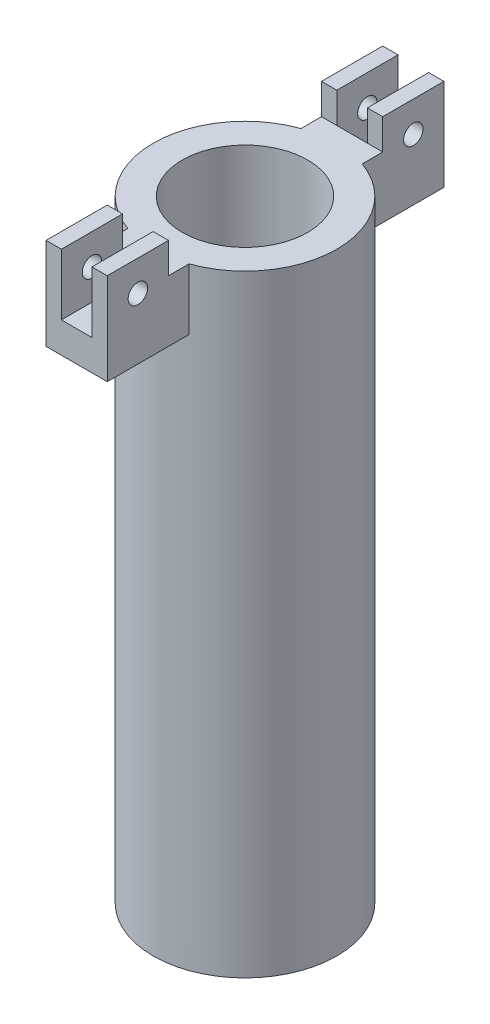
ISO-10303-21;
HEADER;
FILE_DESCRIPTION(('STEP AP214'),'2;1');
FILE_NAME('part.step','',(''),(''),'','','');
FILE_SCHEMA(('AUTOMOTIVE_DESIGN { 1 0 10303 214 1 1 1 1 }'));
ENDSEC;
DATA;
#1=APPLICATION_CONTEXT('core data for automotive mechanical design processes');
#2=APPLICATION_PROTOCOL_DEFINITION('international standard','automotive_design',2000,#1);
#3=PRODUCT_CONTEXT('',#1,'mechanical');
#4=PRODUCT('Part','Part','',(#3));
#5=PRODUCT_RELATED_PRODUCT_CATEGORY('part','',(#4));
#6=PRODUCT_DEFINITION_FORMATION('','',#4);
#7=PRODUCT_DEFINITION_CONTEXT('part definition',#1,'design');
#8=PRODUCT_DEFINITION('design','',#6,#7);
#9=PRODUCT_DEFINITION_SHAPE('','',#8);
#10=(LENGTH_UNIT() NAMED_UNIT(*) SI_UNIT(.MILLI.,.METRE.));
#11=(NAMED_UNIT(*) PLANE_ANGLE_UNIT() SI_UNIT($,.RADIAN.));
#12=(NAMED_UNIT(*) SI_UNIT($,.STERADIAN.) SOLID_ANGLE_UNIT());
#13=UNCERTAINTY_MEASURE_WITH_UNIT(LENGTH_MEASURE(1.E-05),#10,'distance_accuracy_value','');
#14=(GEOMETRIC_REPRESENTATION_CONTEXT(3) GLOBAL_UNCERTAINTY_ASSIGNED_CONTEXT((#13)) GLOBAL_UNIT_ASSIGNED_CONTEXT((#10,
#11,#12)) REPRESENTATION_CONTEXT('',''));
#15=CARTESIAN_POINT('',(0.,0.,0.));
#16=DIRECTION('',(0.,0.,1.));
#17=DIRECTION('',(1.,0.,0.));
#18=AXIS2_PLACEMENT_3D('',#15,#16,#17);
#19=CARTESIAN_POINT('',(10.,100.,35.));
#20=DIRECTION('',(0.,0.,-1.));
#21=DIRECTION('',(0.,1.,0.));
#22=AXIS2_PLACEMENT_3D('',#19,#20,#21);
#23=PLANE('',#22);
#24=DIRECTION('',(-1.,0.,0.));
#25=VECTOR('',#24,1.);
#26=CARTESIAN_POINT('',(10.,110.,35.));
#27=LINE('',#26,#25);
#28=CARTESIAN_POINT('',(-5.,110.,35.));
#29=VERTEX_POINT('',#28);
#30=CARTESIAN_POINT('',(-10.,110.,35.));
#31=VERTEX_POINT('',#30);
#32=EDGE_CURVE('E226',#29,#31,#27,.T.);
#33=ORIENTED_EDGE('',*,*,#32,.F.);
#34=DIRECTION('',(0.,-1.,0.));
#35=VECTOR('',#34,1.);
#36=CARTESIAN_POINT('',(-5.,110.,35.));
#37=LINE('',#36,#35);
#38=CARTESIAN_POINT('',(-5.,100.,35.));
#39=VERTEX_POINT('',#38);
#40=EDGE_CURVE('E472',#29,#39,#37,.T.);
#41=ORIENTED_EDGE('',*,*,#40,.T.);
#42=DIRECTION('',(-1.,0.,0.));
#43=VECTOR('',#42,1.);
#44=CARTESIAN_POINT('',(10.,100.,35.));
#45=LINE('',#44,#43);
#46=CARTESIAN_POINT('',(-10.,100.,35.));
#47=VERTEX_POINT('',#46);
#48=EDGE_CURVE('E237',#39,#47,#45,.T.);
#49=ORIENTED_EDGE('',*,*,#48,.T.);
#50=DIRECTION('',(0.,-1.,0.));
#51=VECTOR('',#50,1.);
#52=CARTESIAN_POINT('',(-10.,100.,35.));
#53=LINE('',#52,#51);
#54=EDGE_CURVE('E442',#31,#47,#53,.T.);
#55=ORIENTED_EDGE('',*,*,#54,.F.);
#56=EDGE_LOOP('',(#33,#41,#49,#55));
#57=FACE_BOUND('',#56,.T.);
#58=ADVANCED_FACE('F45',(#57),#23,.T.);
#59=CARTESIAN_POINT('',(10.,100.,35.));
#60=VERTEX_POINT('',#59);
#61=CARTESIAN_POINT('',(5.,100.,35.));
#62=VERTEX_POINT('',#61);
#63=EDGE_CURVE('E238',#60,#62,#45,.T.);
#64=ORIENTED_EDGE('',*,*,#63,.T.);
#65=DIRECTION('',(0.,1.,0.));
#66=VECTOR('',#65,1.);
#67=CARTESIAN_POINT('',(5.,110.,35.));
#68=LINE('',#67,#66);
#69=CARTESIAN_POINT('',(5.,110.,35.));
#70=VERTEX_POINT('',#69);
#71=EDGE_CURVE('E390',#62,#70,#68,.T.);
#72=ORIENTED_EDGE('',*,*,#71,.T.);
#73=CARTESIAN_POINT('',(10.,110.,35.));
#74=VERTEX_POINT('',#73);
#75=EDGE_CURVE('E216',#74,#70,#27,.T.);
#76=ORIENTED_EDGE('',*,*,#75,.F.);
#77=DIRECTION('',(0.,-1.,0.));
#78=VECTOR('',#77,1.);
#79=CARTESIAN_POINT('',(10.,100.,35.));
#80=LINE('',#79,#78);
#81=EDGE_CURVE('E427',#74,#60,#80,.T.);
#82=ORIENTED_EDGE('',*,*,#81,.T.);
#83=EDGE_LOOP('',(#64,#72,#76,#82));
#84=FACE_BOUND('',#83,.T.);
#85=ADVANCED_FACE('F488',(#84),#23,.T.);
#86=CARTESIAN_POINT('',(10.,110.,35.));
#87=DIRECTION('',(0.,1.,0.));
#88=DIRECTION('',(0.,0.,1.));
#89=AXIS2_PLACEMENT_3D('',#86,#87,#88);
#90=PLANE('',#89);
#91=DIRECTION('',(-1.,0.,0.));
#92=VECTOR('',#91,1.);
#93=CARTESIAN_POINT('',(10.,110.,55.));
#94=LINE('',#93,#92);
#95=CARTESIAN_POINT('',(-5.,110.,55.));
#96=VERTEX_POINT('',#95);
#97=CARTESIAN_POINT('',(-10.,110.,55.));
#98=VERTEX_POINT('',#97);
#99=EDGE_CURVE('E227',#96,#98,#94,.T.);
#100=ORIENTED_EDGE('',*,*,#99,.F.);
#101=DIRECTION('',(0.,0.,1.));
#102=VECTOR('',#101,1.);
#103=CARTESIAN_POINT('',(-5.,110.,-57.3606797749979));
#104=LINE('',#103,#102);
#105=EDGE_CURVE('E218',#29,#96,#104,.T.);
#106=ORIENTED_EDGE('',*,*,#105,.F.);
#107=ORIENTED_EDGE('',*,*,#32,.T.);
#108=DIRECTION('',(0.,0.,-1.));
#109=VECTOR('',#108,1.);
#110=CARTESIAN_POINT('',(-10.,110.,35.));
#111=LINE('',#110,#109);
#112=EDGE_CURVE('E445',#98,#31,#111,.T.);
#113=ORIENTED_EDGE('',*,*,#112,.F.);
#114=EDGE_LOOP('',(#100,#106,#107,#113));
#115=FACE_BOUND('',#114,.T.);
#116=ADVANCED_FACE('F466',(#115),#90,.T.);
#117=ORIENTED_EDGE('',*,*,#75,.T.);
#118=DIRECTION('',(0.,0.,1.));
#119=VECTOR('',#118,1.);
#120=CARTESIAN_POINT('',(5.,110.,-57.3606797749979));
#121=LINE('',#120,#119);
#122=CARTESIAN_POINT('',(5.,110.,55.));
#123=VERTEX_POINT('',#122);
#124=EDGE_CURVE('E202',#70,#123,#121,.T.);
#125=ORIENTED_EDGE('',*,*,#124,.T.);
#126=CARTESIAN_POINT('',(10.,110.,55.));
#127=VERTEX_POINT('',#126);
#128=EDGE_CURVE('E214',#127,#123,#94,.T.);
#129=ORIENTED_EDGE('',*,*,#128,.F.);
#130=DIRECTION('',(0.,0.,-1.));
#131=VECTOR('',#130,1.);
#132=CARTESIAN_POINT('',(10.,110.,35.));
#133=LINE('',#132,#131);
#134=EDGE_CURVE('E432',#127,#74,#133,.T.);
#135=ORIENTED_EDGE('',*,*,#134,.T.);
#136=EDGE_LOOP('',(#117,#125,#129,#135));
#137=FACE_BOUND('',#136,.T.);
#138=ADVANCED_FACE('F212',(#137),#90,.T.);
#139=CARTESIAN_POINT('',(10.,110.,55.));
#140=DIRECTION('',(0.,0.,1.));
#141=DIRECTION('',(0.,-1.,0.));
#142=AXIS2_PLACEMENT_3D('',#139,#140,#141);
#143=PLANE('',#142);
#144=DIRECTION('',(-1.,0.,0.));
#145=VECTOR('',#144,1.);
#146=CARTESIAN_POINT('',(5.,90.0000000000001,55.));
#147=LINE('',#146,#145);
#148=CARTESIAN_POINT('',(5.,90.0000000000001,55.));
#149=VERTEX_POINT('',#148);
#150=CARTESIAN_POINT('',(-5.,90.0000000000001,55.));
#151=VERTEX_POINT('',#150);
#152=EDGE_CURVE('E63',#149,#151,#147,.T.);
#153=ORIENTED_EDGE('',*,*,#152,.T.);
#154=DIRECTION('',(0.,1.,0.));
#155=VECTOR('',#154,1.);
#156=CARTESIAN_POINT('',(-5.,110.,55.));
#157=LINE('',#156,#155);
#158=EDGE_CURVE('E208',#151,#96,#157,.T.);
#159=ORIENTED_EDGE('',*,*,#158,.T.);
#160=ORIENTED_EDGE('',*,*,#99,.T.);
#161=DIRECTION('',(0.,1.,0.));
#162=VECTOR('',#161,1.);
#163=CARTESIAN_POINT('',(-10.,110.,55.));
#164=LINE('',#163,#162);
#165=CARTESIAN_POINT('',(-10.,80.,55.));
#166=VERTEX_POINT('',#165);
#167=EDGE_CURVE('E449',#166,#98,#164,.T.);
#168=ORIENTED_EDGE('',*,*,#167,.F.);
#169=DIRECTION('',(-1.,0.,0.));
#170=VECTOR('',#169,1.);
#171=CARTESIAN_POINT('',(10.,80.,55.));
#172=LINE('',#171,#170);
#173=CARTESIAN_POINT('',(10.,80.,55.));
#174=VERTEX_POINT('',#173);
#175=EDGE_CURVE('E232',#174,#166,#172,.T.);
#176=ORIENTED_EDGE('',*,*,#175,.F.);
#177=DIRECTION('',(0.,1.,0.));
#178=VECTOR('',#177,1.);
#179=CARTESIAN_POINT('',(10.,110.,55.));
#180=LINE('',#179,#178);
#181=EDGE_CURVE('E224',#174,#127,#180,.T.);
#182=ORIENTED_EDGE('',*,*,#181,.T.);
#183=ORIENTED_EDGE('',*,*,#128,.T.);
#184=DIRECTION('',(0.,-1.,0.));
#185=VECTOR('',#184,1.);
#186=CARTESIAN_POINT('',(5.,110.,55.));
#187=LINE('',#186,#185);
#188=EDGE_CURVE('E198',#123,#149,#187,.T.);
#189=ORIENTED_EDGE('',*,*,#188,.T.);
#190=EDGE_LOOP('',(#153,#159,#160,#168,#176,#182,#183,#189));
#191=FACE_BOUND('',#190,.T.);
#192=ADVANCED_FACE('F221',(#191),#143,.T.);
#193=CARTESIAN_POINT('',(10.,100.,45.));
#194=DIRECTION('',(-1.,0.,0.));
#195=DIRECTION('',(0.,0.,1.));
#196=AXIS2_PLACEMENT_3D('',#193,#194,#195);
#197=CYLINDRICAL_SURFACE('',#196,3.175);
#198=CARTESIAN_POINT('',(-10.,100.,45.));
#199=DIRECTION('',(-1.,0.,0.));
#200=DIRECTION('',(0.,0.,1.));
#201=AXIS2_PLACEMENT_3D('',#198,#199,#200);
#202=CIRCLE('',#201,3.175);
#203=CARTESIAN_POINT('',(-10.,100.,48.175));
#204=VERTEX_POINT('',#203);
#205=EDGE_CURVE('E415',#204,#204,#202,.T.);
#206=ORIENTED_EDGE('',*,*,#205,.T.);
#207=EDGE_LOOP('',(#206));
#208=FACE_BOUND('',#207,.T.);
#209=CARTESIAN_POINT('',(-5.,100.,45.));
#210=DIRECTION('',(1.,0.,0.));
#211=DIRECTION('',(0.,1.,0.));
#212=AXIS2_PLACEMENT_3D('',#209,#210,#211);
#213=CIRCLE('',#212,3.175);
#214=CARTESIAN_POINT('',(-5.,103.175,45.));
#215=VERTEX_POINT('',#214);
#216=EDGE_CURVE('E49',#215,#215,#213,.F.);
#217=ORIENTED_EDGE('',*,*,#216,.F.);
#218=EDGE_LOOP('',(#217));
#219=FACE_BOUND('',#218,.T.);
#220=ADVANCED_FACE('F504',(#208,#219),#197,.F.);
#221=CARTESIAN_POINT('',(10.,100.,45.));
#222=DIRECTION('',(-1.,0.,0.));
#223=DIRECTION('',(0.,0.,1.));
#224=AXIS2_PLACEMENT_3D('',#221,#222,#223);
#225=CIRCLE('',#224,3.175);
#226=CARTESIAN_POINT('',(10.,100.,48.175));
#227=VERTEX_POINT('',#226);
#228=EDGE_CURVE('E416',#227,#227,#225,.T.);
#229=ORIENTED_EDGE('',*,*,#228,.F.);
#230=EDGE_LOOP('',(#229));
#231=FACE_BOUND('',#230,.T.);
#232=CARTESIAN_POINT('',(5.,100.,45.));
#233=DIRECTION('',(-1.,0.,0.));
#234=DIRECTION('',(0.,-1.,0.));
#235=AXIS2_PLACEMENT_3D('',#232,#233,#234);
#236=CIRCLE('',#235,3.175);
#237=CARTESIAN_POINT('',(5.,96.825,45.));
#238=VERTEX_POINT('',#237);
#239=EDGE_CURVE('E380',#238,#238,#236,.F.);
#240=ORIENTED_EDGE('',*,*,#239,.F.);
#241=EDGE_LOOP('',(#240));
#242=FACE_BOUND('',#241,.T.);
#243=ADVANCED_FACE('F506',(#231,#242),#197,.F.);
#244=CARTESIAN_POINT('',(0.,100.,0.));
#245=DIRECTION('',(0.,-1.,0.));
#246=DIRECTION('',(0.,0.,-1.));
#247=AXIS2_PLACEMENT_3D('',#244,#245,#246);
#248=CYLINDRICAL_SURFACE('',#247,30.);
#249=CARTESIAN_POINT('',(0.,-100.,0.));
#250=DIRECTION('',(0.,1.,0.));
#251=DIRECTION('',(0.,0.,1.));
#252=AXIS2_PLACEMENT_3D('',#249,#250,#251);
#253=CIRCLE('',#252,30.);
#254=CARTESIAN_POINT('',(0.,-100.,30.));
#255=VERTEX_POINT('',#254);
#256=EDGE_CURVE('E368',#255,#255,#253,.T.);
#257=ORIENTED_EDGE('',*,*,#256,.T.);
#258=EDGE_LOOP('',(#257));
#259=FACE_BOUND('',#258,.T.);
#260=DIRECTION('',(0.,-1.,0.));
#261=VECTOR('',#260,1.);
#262=CARTESIAN_POINT('',(10.,100.,28.2842712474619));
#263=LINE('',#262,#261);
#264=CARTESIAN_POINT('',(10.,80.,28.2842712474619));
#265=VERTEX_POINT('',#264);
#266=CARTESIAN_POINT('',(10.,100.,28.2842712474619));
#267=VERTEX_POINT('',#266);
#268=EDGE_CURVE('E249',#265,#267,#263,.F.);
#269=ORIENTED_EDGE('',*,*,#268,.F.);
#270=CARTESIAN_POINT('',(0.,80.,0.));
#271=DIRECTION('',(0.,-1.,0.));
#272=DIRECTION('',(0.,0.,-1.));
#273=AXIS2_PLACEMENT_3D('',#270,#271,#272);
#274=CIRCLE('',#273,30.);
#275=CARTESIAN_POINT('',(-10.,80.,28.2842712474619));
#276=VERTEX_POINT('',#275);
#277=EDGE_CURVE('E242',#265,#276,#274,.T.);
#278=ORIENTED_EDGE('',*,*,#277,.T.);
#279=DIRECTION('',(0.,-1.,0.));
#280=VECTOR('',#279,1.);
#281=CARTESIAN_POINT('',(-10.,100.,28.2842712474619));
#282=LINE('',#281,#280);
#283=CARTESIAN_POINT('',(-10.,100.,28.2842712474619));
#284=VERTEX_POINT('',#283);
#285=EDGE_CURVE('E246',#276,#284,#282,.F.);
#286=ORIENTED_EDGE('',*,*,#285,.T.);
#287=CARTESIAN_POINT('',(0.,100.,0.));
#288=DIRECTION('',(0.,1.,0.));
#289=DIRECTION('',(0.,0.,1.));
#290=AXIS2_PLACEMENT_3D('',#287,#288,#289);
#291=CIRCLE('',#290,30.);
#292=CARTESIAN_POINT('',(-10.,100.,-28.2842712474619));
#293=VERTEX_POINT('',#292);
#294=EDGE_CURVE('E11',#293,#284,#291,.T.);
#295=ORIENTED_EDGE('',*,*,#294,.F.);
#296=DIRECTION('',(0.,-1.,0.));
#297=VECTOR('',#296,1.);
#298=CARTESIAN_POINT('',(-10.,100.,-28.2842712474619));
#299=LINE('',#298,#297);
#300=CARTESIAN_POINT('',(-10.,80.,-28.2842712474619));
#301=VERTEX_POINT('',#300);
#302=EDGE_CURVE('E356',#293,#301,#299,.T.);
#303=ORIENTED_EDGE('',*,*,#302,.T.);
#304=CARTESIAN_POINT('',(0.,80.,0.));
#305=DIRECTION('',(0.,1.,0.));
#306=DIRECTION('',(0.,0.,1.));
#307=AXIS2_PLACEMENT_3D('',#304,#305,#306);
#308=CIRCLE('',#307,30.);
#309=CARTESIAN_POINT('',(10.,80.,-28.2842712474619));
#310=VERTEX_POINT('',#309);
#311=EDGE_CURVE('E353',#310,#301,#308,.T.);
#312=ORIENTED_EDGE('',*,*,#311,.F.);
#313=DIRECTION('',(0.,-1.,0.));
#314=VECTOR('',#313,1.);
#315=CARTESIAN_POINT('',(10.,100.,-28.2842712474619));
#316=LINE('',#315,#314);
#317=CARTESIAN_POINT('',(10.,100.,-28.2842712474619));
#318=VERTEX_POINT('',#317);
#319=EDGE_CURVE('E360',#318,#310,#316,.T.);
#320=ORIENTED_EDGE('',*,*,#319,.F.);
#321=EDGE_CURVE('E55',#267,#318,#291,.T.);
#322=ORIENTED_EDGE('',*,*,#321,.F.);
#323=EDGE_LOOP('',(#269,#278,#286,#295,#303,#312,#320,#322));
#324=FACE_BOUND('',#323,.T.);
#325=ADVANCED_FACE('F47',(#259,#324),#248,.T.);
#326=CARTESIAN_POINT('',(10.,110.,-35.));
#327=DIRECTION('',(0.,-1.,0.));
#328=DIRECTION('',(0.,0.,-1.));
#329=AXIS2_PLACEMENT_3D('',#326,#327,#328);
#330=PLANE('',#329);
#331=DIRECTION('',(-1.,0.,0.));
#332=VECTOR('',#331,1.);
#333=CARTESIAN_POINT('',(10.,110.,-55.));
#334=LINE('',#333,#332);
#335=CARTESIAN_POINT('',(10.,110.,-55.));
#336=VERTEX_POINT('',#335);
#337=CARTESIAN_POINT('',(5.,110.,-55.));
#338=VERTEX_POINT('',#337);
#339=EDGE_CURVE('E345',#336,#338,#334,.T.);
#340=ORIENTED_EDGE('',*,*,#339,.T.);
#341=DIRECTION('',(0.,0.,-1.));
#342=VECTOR('',#341,1.);
#343=CARTESIAN_POINT('',(5.,110.,-12.6393202250021));
#344=LINE('',#343,#342);
#345=CARTESIAN_POINT('',(5.,110.,-35.));
#346=VERTEX_POINT('',#345);
#347=EDGE_CURVE('E275',#346,#338,#344,.T.);
#348=ORIENTED_EDGE('',*,*,#347,.F.);
#349=DIRECTION('',(-1.,0.,0.));
#350=VECTOR('',#349,1.);
#351=CARTESIAN_POINT('',(10.,110.,-35.));
#352=LINE('',#351,#350);
#353=CARTESIAN_POINT('',(10.,110.,-35.));
#354=VERTEX_POINT('',#353);
#355=EDGE_CURVE('E340',#354,#346,#352,.T.);
#356=ORIENTED_EDGE('',*,*,#355,.F.);
#357=DIRECTION('',(0.,0.,1.));
#358=VECTOR('',#357,1.);
#359=CARTESIAN_POINT('',(10.,110.,-35.));
#360=LINE('',#359,#358);
#361=EDGE_CURVE('E307',#336,#354,#360,.T.);
#362=ORIENTED_EDGE('',*,*,#361,.F.);
#363=EDGE_LOOP('',(#340,#348,#356,#362));
#364=FACE_BOUND('',#363,.T.);
#365=ADVANCED_FACE('F565',(#364),#330,.F.);
#366=CARTESIAN_POINT('',(10.,100.,-35.));
#367=DIRECTION('',(0.,0.,-1.));
#368=DIRECTION('',(0.,1.,0.));
#369=AXIS2_PLACEMENT_3D('',#366,#367,#368);
#370=PLANE('',#369);
#371=ORIENTED_EDGE('',*,*,#355,.T.);
#372=DIRECTION('',(0.,1.,0.));
#373=VECTOR('',#372,1.);
#374=CARTESIAN_POINT('',(5.,110.,-35.));
#375=LINE('',#374,#373);
#376=CARTESIAN_POINT('',(5.,100.,-35.));
#377=VERTEX_POINT('',#376);
#378=EDGE_CURVE('E257',#377,#346,#375,.T.);
#379=ORIENTED_EDGE('',*,*,#378,.F.);
#380=DIRECTION('',(-1.,0.,0.));
#381=VECTOR('',#380,1.);
#382=CARTESIAN_POINT('',(10.,100.,-35.));
#383=LINE('',#382,#381);
#384=CARTESIAN_POINT('',(10.,100.,-35.));
#385=VERTEX_POINT('',#384);
#386=EDGE_CURVE('E334',#385,#377,#383,.T.);
#387=ORIENTED_EDGE('',*,*,#386,.F.);
#388=DIRECTION('',(0.,-1.,0.));
#389=VECTOR('',#388,1.);
#390=CARTESIAN_POINT('',(10.,100.,-35.));
#391=LINE('',#390,#389);
#392=EDGE_CURVE('E310',#354,#385,#391,.T.);
#393=ORIENTED_EDGE('',*,*,#392,.F.);
#394=EDGE_LOOP('',(#371,#379,#387,#393));
#395=FACE_BOUND('',#394,.T.);
#396=ADVANCED_FACE('F560',(#395),#370,.F.);
#397=CARTESIAN_POINT('',(10.,100.,-45.));
#398=DIRECTION('',(-1.,0.,0.));
#399=DIRECTION('',(0.,0.,1.));
#400=AXIS2_PLACEMENT_3D('',#397,#398,#399);
#401=CYLINDRICAL_SURFACE('',#400,3.175);
#402=CARTESIAN_POINT('',(5.,100.,-45.));
#403=DIRECTION('',(1.,0.,0.));
#404=DIRECTION('',(0.,1.,0.));
#405=AXIS2_PLACEMENT_3D('',#402,#403,#404);
#406=CIRCLE('',#405,3.175);
#407=CARTESIAN_POINT('',(5.,103.175,-45.));
#408=VERTEX_POINT('',#407);
#409=EDGE_CURVE('E299',#408,#408,#406,.T.);
#410=ORIENTED_EDGE('',*,*,#409,.F.);
#411=EDGE_LOOP('',(#410));
#412=FACE_BOUND('',#411,.T.);
#413=CARTESIAN_POINT('',(10.,100.,-45.));
#414=DIRECTION('',(1.,0.,0.));
#415=DIRECTION('',(0.,0.,-1.));
#416=AXIS2_PLACEMENT_3D('',#413,#414,#415);
#417=CIRCLE('',#416,3.175);
#418=CARTESIAN_POINT('',(10.,100.,-48.175));
#419=VERTEX_POINT('',#418);
#420=EDGE_CURVE('E290',#419,#419,#417,.T.);
#421=ORIENTED_EDGE('',*,*,#420,.T.);
#422=EDGE_LOOP('',(#421));
#423=FACE_BOUND('',#422,.T.);
#424=ADVANCED_FACE('F545',(#412,#423),#401,.F.);
#425=CARTESIAN_POINT('',(0.,100.,0.));
#426=DIRECTION('',(0.,1.,0.));
#427=DIRECTION('',(0.,0.,1.));
#428=AXIS2_PLACEMENT_3D('',#425,#426,#427);
#429=PLANE('',#428);
#430=CARTESIAN_POINT('',(0.,100.,0.));
#431=DIRECTION('',(0.,1.,0.));
#432=DIRECTION('',(0.,0.,1.));
#433=AXIS2_PLACEMENT_3D('',#430,#431,#432);
#434=CIRCLE('',#433,20.5);
#435=CARTESIAN_POINT('',(0.,100.,20.5));
#436=VERTEX_POINT('',#435);
#437=EDGE_CURVE('E363',#436,#436,#434,.T.);
#438=ORIENTED_EDGE('',*,*,#437,.F.);
#439=EDGE_LOOP('',(#438));
#440=FACE_BOUND('',#439,.T.);
#441=ORIENTED_EDGE('',*,*,#294,.T.);
#442=DIRECTION('',(0.,0.,-1.));
#443=VECTOR('',#442,1.);
#444=CARTESIAN_POINT('',(-10.,100.,20.5));
#445=LINE('',#444,#443);
#446=EDGE_CURVE('E71',#47,#284,#445,.T.);
#447=ORIENTED_EDGE('',*,*,#446,.F.);
#448=ORIENTED_EDGE('',*,*,#48,.F.);
#449=DIRECTION('',(1.,0.,0.));
#450=VECTOR('',#449,1.);
#451=CARTESIAN_POINT('',(0.,100.,35.));
#452=LINE('',#451,#450);
#453=EDGE_CURVE('E388',#39,#62,#452,.T.);
#454=ORIENTED_EDGE('',*,*,#453,.T.);
#455=ORIENTED_EDGE('',*,*,#63,.F.);
#456=DIRECTION('',(0.,0.,-1.));
#457=VECTOR('',#456,1.);
#458=CARTESIAN_POINT('',(10.,100.,20.5));
#459=LINE('',#458,#457);
#460=EDGE_CURVE('E423',#60,#267,#459,.T.);
#461=ORIENTED_EDGE('',*,*,#460,.T.);
#462=ORIENTED_EDGE('',*,*,#321,.T.);
#463=DIRECTION('',(0.,0.,1.));
#464=VECTOR('',#463,1.);
#465=CARTESIAN_POINT('',(10.,100.,-20.5));
#466=LINE('',#465,#464);
#467=EDGE_CURVE('E313',#385,#318,#466,.T.);
#468=ORIENTED_EDGE('',*,*,#467,.F.);
#469=ORIENTED_EDGE('',*,*,#386,.T.);
#470=CARTESIAN_POINT('',(-5.,100.,-35.));
#471=VERTEX_POINT('',#470);
#472=EDGE_CURVE('E339',#377,#471,#383,.T.);
#473=ORIENTED_EDGE('',*,*,#472,.T.);
#474=CARTESIAN_POINT('',(-10.,100.,-35.));
#475=VERTEX_POINT('',#474);
#476=EDGE_CURVE('E317',#471,#475,#383,.T.);
#477=ORIENTED_EDGE('',*,*,#476,.T.);
#478=DIRECTION('',(0.,0.,1.));
#479=VECTOR('',#478,1.);
#480=CARTESIAN_POINT('',(-10.,100.,-20.5));
#481=LINE('',#480,#479);
#482=EDGE_CURVE('E304',#475,#293,#481,.T.);
#483=ORIENTED_EDGE('',*,*,#482,.T.);
#484=EDGE_LOOP('',(#441,#447,#448,#454,#455,#461,#462,#468,#469,#473,#477,#483));
#485=FACE_BOUND('',#484,.T.);
#486=ADVANCED_FACE('F475',(#440,#485),#429,.T.);
#487=CARTESIAN_POINT('',(0.,-100.,0.));
#488=DIRECTION('',(0.,1.,0.));
#489=DIRECTION('',(0.,0.,1.));
#490=AXIS2_PLACEMENT_3D('',#487,#488,#489);
#491=PLANE('',#490);
#492=ORIENTED_EDGE('',*,*,#256,.F.);
#493=EDGE_LOOP('',(#492));
#494=FACE_BOUND('',#493,.T.);
#495=ADVANCED_FACE('F578',(#494),#491,.F.);
#496=CARTESIAN_POINT('',(0.,-50.,0.));
#497=DIRECTION('',(0.,1.,0.));
#498=DIRECTION('',(0.,0.,1.));
#499=AXIS2_PLACEMENT_3D('',#496,#497,#498);
#500=CYLINDRICAL_SURFACE('',#499,20.5);
#501=CARTESIAN_POINT('',(0.,-50.,0.));
#502=DIRECTION('',(0.,1.,0.));
#503=DIRECTION('',(0.,0.,1.));
#504=AXIS2_PLACEMENT_3D('',#501,#502,#503);
#505=CIRCLE('',#504,20.5);
#506=CARTESIAN_POINT('',(0.,-50.,20.5));
#507=VERTEX_POINT('',#506);
#508=EDGE_CURVE('E364',#507,#507,#505,.T.);
#509=ORIENTED_EDGE('',*,*,#508,.F.);
#510=EDGE_LOOP('',(#509));
#511=FACE_BOUND('',#510,.T.);
#512=ORIENTED_EDGE('',*,*,#437,.T.);
#513=EDGE_LOOP('',(#512));
#514=FACE_BOUND('',#513,.T.);
#515=ADVANCED_FACE('F574',(#511,#514),#500,.F.);
#516=CARTESIAN_POINT('',(0.,-50.,0.));
#517=DIRECTION('',(0.,1.,0.));
#518=DIRECTION('',(0.,0.,1.));
#519=AXIS2_PLACEMENT_3D('',#516,#517,#518);
#520=PLANE('',#519);
#521=ORIENTED_EDGE('',*,*,#508,.T.);
#522=EDGE_LOOP('',(#521));
#523=FACE_BOUND('',#522,.T.);
#524=ADVANCED_FACE('F550',(#523),#520,.T.);
#525=CARTESIAN_POINT('',(10.,0.,0.));
#526=DIRECTION('',(-1.,0.,0.));
#527=DIRECTION('',(0.,0.,1.));
#528=AXIS2_PLACEMENT_3D('',#525,#526,#527);
#529=PLANE('',#528);
#530=ORIENTED_EDGE('',*,*,#420,.F.);
#531=EDGE_LOOP('',(#530));
#532=FACE_BOUND('',#531,.T.);
#533=ORIENTED_EDGE('',*,*,#467,.T.);
#534=ORIENTED_EDGE('',*,*,#319,.T.);
#535=DIRECTION('',(0.,0.,-1.));
#536=VECTOR('',#535,1.);
#537=CARTESIAN_POINT('',(10.,80.,-55.));
#538=LINE('',#537,#536);
#539=CARTESIAN_POINT('',(10.,80.,-55.));
#540=VERTEX_POINT('',#539);
#541=EDGE_CURVE('E300',#310,#540,#538,.T.);
#542=ORIENTED_EDGE('',*,*,#541,.T.);
#543=DIRECTION('',(0.,1.,0.));
#544=VECTOR('',#543,1.);
#545=CARTESIAN_POINT('',(10.,110.,-55.));
#546=LINE('',#545,#544);
#547=EDGE_CURVE('E303',#540,#336,#546,.T.);
#548=ORIENTED_EDGE('',*,*,#547,.T.);
#549=ORIENTED_EDGE('',*,*,#361,.T.);
#550=ORIENTED_EDGE('',*,*,#392,.T.);
#551=EDGE_LOOP('',(#533,#534,#542,#548,#549,#550));
#552=FACE_BOUND('',#551,.T.);
#553=ADVANCED_FACE('F546',(#532,#552),#529,.F.);
#554=CARTESIAN_POINT('',(-10.,0.,0.));
#555=DIRECTION('',(-1.,0.,0.));
#556=DIRECTION('',(0.,0.,1.));
#557=AXIS2_PLACEMENT_3D('',#554,#555,#556);
#558=PLANE('',#557);
#559=CARTESIAN_POINT('',(-10.,100.,-45.));
#560=DIRECTION('',(1.,0.,0.));
#561=DIRECTION('',(0.,0.,-1.));
#562=AXIS2_PLACEMENT_3D('',#559,#560,#561);
#563=CIRCLE('',#562,3.175);
#564=CARTESIAN_POINT('',(-10.,100.,-48.175));
#565=VERTEX_POINT('',#564);
#566=EDGE_CURVE('E295',#565,#565,#563,.T.);
#567=ORIENTED_EDGE('',*,*,#566,.T.);
#568=EDGE_LOOP('',(#567));
#569=FACE_BOUND('',#568,.T.);
#570=ORIENTED_EDGE('',*,*,#302,.F.);
#571=ORIENTED_EDGE('',*,*,#482,.F.);
#572=DIRECTION('',(0.,-1.,0.));
#573=VECTOR('',#572,1.);
#574=CARTESIAN_POINT('',(-10.,100.,-35.));
#575=LINE('',#574,#573);
#576=CARTESIAN_POINT('',(-10.,110.,-35.));
#577=VERTEX_POINT('',#576);
#578=EDGE_CURVE('E328',#577,#475,#575,.T.);
#579=ORIENTED_EDGE('',*,*,#578,.F.);
#580=DIRECTION('',(0.,0.,1.));
#581=VECTOR('',#580,1.);
#582=CARTESIAN_POINT('',(-10.,110.,-35.));
#583=LINE('',#582,#581);
#584=CARTESIAN_POINT('',(-10.,110.,-55.));
#585=VERTEX_POINT('',#584);
#586=EDGE_CURVE('E324',#585,#577,#583,.T.);
#587=ORIENTED_EDGE('',*,*,#586,.F.);
#588=DIRECTION('',(0.,1.,0.));
#589=VECTOR('',#588,1.);
#590=CARTESIAN_POINT('',(-10.,110.,-55.));
#591=LINE('',#590,#589);
#592=CARTESIAN_POINT('',(-10.,80.,-55.));
#593=VERTEX_POINT('',#592);
#594=EDGE_CURVE('E320',#593,#585,#591,.T.);
#595=ORIENTED_EDGE('',*,*,#594,.F.);
#596=DIRECTION('',(0.,0.,-1.));
#597=VECTOR('',#596,1.);
#598=CARTESIAN_POINT('',(-10.,80.,-55.));
#599=LINE('',#598,#597);
#600=EDGE_CURVE('E294',#301,#593,#599,.T.);
#601=ORIENTED_EDGE('',*,*,#600,.F.);
#602=EDGE_LOOP('',(#570,#571,#579,#587,#595,#601));
#603=FACE_BOUND('',#602,.T.);
#604=ADVANCED_FACE('F549',(#569,#603),#558,.T.);
#605=CARTESIAN_POINT('',(10.,80.,-55.));
#606=DIRECTION('',(0.,1.,0.));
#607=DIRECTION('',(0.,0.,1.));
#608=AXIS2_PLACEMENT_3D('',#605,#606,#607);
#609=PLANE('',#608);
#610=ORIENTED_EDGE('',*,*,#541,.F.);
#611=ORIENTED_EDGE('',*,*,#311,.T.);
#612=ORIENTED_EDGE('',*,*,#600,.T.);
#613=DIRECTION('',(-1.,0.,0.));
#614=VECTOR('',#613,1.);
#615=CARTESIAN_POINT('',(10.,80.,-55.));
#616=LINE('',#615,#614);
#617=EDGE_CURVE('E349',#540,#593,#616,.T.);
#618=ORIENTED_EDGE('',*,*,#617,.F.);
#619=EDGE_LOOP('',(#610,#611,#612,#618));
#620=FACE_BOUND('',#619,.T.);
#621=ADVANCED_FACE('F554',(#620),#609,.F.);
#622=CARTESIAN_POINT('',(10.,110.,-55.));
#623=DIRECTION('',(0.,0.,1.));
#624=DIRECTION('',(0.,-1.,0.));
#625=AXIS2_PLACEMENT_3D('',#622,#623,#624);
#626=PLANE('',#625);
#627=DIRECTION('',(-1.,0.,0.));
#628=VECTOR('',#627,1.);
#629=CARTESIAN_POINT('',(5.,90.0000000000001,-55.));
#630=LINE('',#629,#628);
#631=CARTESIAN_POINT('',(5.,90.0000000000001,-55.));
#632=VERTEX_POINT('',#631);
#633=CARTESIAN_POINT('',(-5.,90.0000000000001,-55.));
#634=VERTEX_POINT('',#633);
#635=EDGE_CURVE('E267',#632,#634,#630,.T.);
#636=ORIENTED_EDGE('',*,*,#635,.F.);
#637=DIRECTION('',(0.,-1.,0.));
#638=VECTOR('',#637,1.);
#639=CARTESIAN_POINT('',(5.,110.,-55.));
#640=LINE('',#639,#638);
#641=EDGE_CURVE('E252',#338,#632,#640,.T.);
#642=ORIENTED_EDGE('',*,*,#641,.F.);
#643=ORIENTED_EDGE('',*,*,#339,.F.);
#644=ORIENTED_EDGE('',*,*,#547,.F.);
#645=ORIENTED_EDGE('',*,*,#617,.T.);
#646=ORIENTED_EDGE('',*,*,#594,.T.);
#647=CARTESIAN_POINT('',(-5.,110.,-55.));
#648=VERTEX_POINT('',#647);
#649=EDGE_CURVE('E344',#648,#585,#334,.T.);
#650=ORIENTED_EDGE('',*,*,#649,.F.);
#651=DIRECTION('',(0.,1.,0.));
#652=VECTOR('',#651,1.);
#653=CARTESIAN_POINT('',(-5.,110.,-55.));
#654=LINE('',#653,#652);
#655=EDGE_CURVE('E271',#634,#648,#654,.T.);
#656=ORIENTED_EDGE('',*,*,#655,.F.);
#657=EDGE_LOOP('',(#636,#642,#643,#644,#645,#646,#650,#656));
#658=FACE_BOUND('',#657,.T.);
#659=ADVANCED_FACE('F563',(#658),#626,.F.);
#660=CARTESIAN_POINT('',(-5.,110.,-35.));
#661=VERTEX_POINT('',#660);
#662=EDGE_CURVE('E338',#661,#577,#352,.T.);
#663=ORIENTED_EDGE('',*,*,#662,.F.);
#664=DIRECTION('',(0.,0.,-1.));
#665=VECTOR('',#664,1.);
#666=CARTESIAN_POINT('',(-5.,110.,-12.6393202250021));
#667=LINE('',#666,#665);
#668=EDGE_CURVE('E278',#661,#648,#667,.T.);
#669=ORIENTED_EDGE('',*,*,#668,.T.);
#670=ORIENTED_EDGE('',*,*,#649,.T.);
#671=ORIENTED_EDGE('',*,*,#586,.T.);
#672=EDGE_LOOP('',(#663,#669,#670,#671));
#673=FACE_BOUND('',#672,.T.);
#674=ADVANCED_FACE('F558',(#673),#330,.F.);
#675=ORIENTED_EDGE('',*,*,#476,.F.);
#676=DIRECTION('',(0.,-1.,0.));
#677=VECTOR('',#676,1.);
#678=CARTESIAN_POINT('',(-5.,110.,-35.));
#679=LINE('',#678,#677);
#680=EDGE_CURVE('E253',#661,#471,#679,.T.);
#681=ORIENTED_EDGE('',*,*,#680,.F.);
#682=ORIENTED_EDGE('',*,*,#662,.T.);
#683=ORIENTED_EDGE('',*,*,#578,.T.);
#684=EDGE_LOOP('',(#675,#681,#682,#683));
#685=FACE_BOUND('',#684,.T.);
#686=ADVANCED_FACE('F543',(#685),#370,.F.);
#687=CARTESIAN_POINT('',(-5.,100.,-45.));
#688=DIRECTION('',(-1.,0.,0.));
#689=DIRECTION('',(0.,-1.,0.));
#690=AXIS2_PLACEMENT_3D('',#687,#688,#689);
#691=CIRCLE('',#690,3.175);
#692=CARTESIAN_POINT('',(-5.,96.825,-45.));
#693=VERTEX_POINT('',#692);
#694=EDGE_CURVE('E289',#693,#693,#691,.T.);
#695=ORIENTED_EDGE('',*,*,#694,.F.);
#696=EDGE_LOOP('',(#695));
#697=FACE_BOUND('',#696,.T.);
#698=ORIENTED_EDGE('',*,*,#566,.F.);
#699=EDGE_LOOP('',(#698));
#700=FACE_BOUND('',#699,.T.);
#701=ADVANCED_FACE('F539',(#697,#700),#401,.F.);
#702=CARTESIAN_POINT('',(5.,110.,-12.6393202250021));
#703=DIRECTION('',(1.,0.,0.));
#704=DIRECTION('',(0.,1.,0.));
#705=AXIS2_PLACEMENT_3D('',#702,#703,#704);
#706=PLANE('',#705);
#707=ORIENTED_EDGE('',*,*,#409,.T.);
#708=EDGE_LOOP('',(#707));
#709=FACE_BOUND('',#708,.T.);
#710=CARTESIAN_POINT('',(5.,90.,-35.));
#711=VERTEX_POINT('',#710);
#712=EDGE_CURVE('E259',#711,#377,#375,.T.);
#713=ORIENTED_EDGE('',*,*,#712,.T.);
#714=ORIENTED_EDGE('',*,*,#378,.T.);
#715=ORIENTED_EDGE('',*,*,#347,.T.);
#716=ORIENTED_EDGE('',*,*,#641,.T.);
#717=DIRECTION('',(0.,0.,-1.));
#718=VECTOR('',#717,1.);
#719=CARTESIAN_POINT('',(5.,90.,-12.6393202250021));
#720=LINE('',#719,#718);
#721=EDGE_CURVE('E274',#711,#632,#720,.T.);
#722=ORIENTED_EDGE('',*,*,#721,.F.);
#723=EDGE_LOOP('',(#713,#714,#715,#716,#722));
#724=FACE_BOUND('',#723,.T.);
#725=ADVANCED_FACE('F532',(#709,#724),#706,.F.);
#726=CARTESIAN_POINT('',(-5.,110.,-12.6393202250021));
#727=DIRECTION('',(-1.,0.,0.));
#728=DIRECTION('',(0.,-1.,0.));
#729=AXIS2_PLACEMENT_3D('',#726,#727,#728);
#730=PLANE('',#729);
#731=ORIENTED_EDGE('',*,*,#694,.T.);
#732=EDGE_LOOP('',(#731));
#733=FACE_BOUND('',#732,.T.);
#734=ORIENTED_EDGE('',*,*,#680,.T.);
#735=CARTESIAN_POINT('',(-5.,90.,-35.));
#736=VERTEX_POINT('',#735);
#737=EDGE_CURVE('E258',#471,#736,#679,.T.);
#738=ORIENTED_EDGE('',*,*,#737,.T.);
#739=DIRECTION('',(0.,0.,-1.));
#740=VECTOR('',#739,1.);
#741=CARTESIAN_POINT('',(-5.,90.,-12.6393202250021));
#742=LINE('',#741,#740);
#743=EDGE_CURVE('E282',#736,#634,#742,.T.);
#744=ORIENTED_EDGE('',*,*,#743,.T.);
#745=ORIENTED_EDGE('',*,*,#655,.T.);
#746=ORIENTED_EDGE('',*,*,#668,.F.);
#747=EDGE_LOOP('',(#734,#738,#744,#745,#746));
#748=FACE_BOUND('',#747,.T.);
#749=ADVANCED_FACE('F529',(#733,#748),#730,.F.);
#750=CARTESIAN_POINT('',(5.,90.,-12.6393202250021));
#751=DIRECTION('',(0.,-1.,0.));
#752=DIRECTION('',(0.,0.,-1.));
#753=AXIS2_PLACEMENT_3D('',#750,#751,#752);
#754=PLANE('',#753);
#755=DIRECTION('',(1.,0.,0.));
#756=VECTOR('',#755,1.);
#757=CARTESIAN_POINT('',(5.,90.,-35.));
#758=LINE('',#757,#756);
#759=EDGE_CURVE('E263',#736,#711,#758,.T.);
#760=ORIENTED_EDGE('',*,*,#759,.T.);
#761=ORIENTED_EDGE('',*,*,#721,.T.);
#762=ORIENTED_EDGE('',*,*,#635,.T.);
#763=ORIENTED_EDGE('',*,*,#743,.F.);
#764=EDGE_LOOP('',(#760,#761,#762,#763));
#765=FACE_BOUND('',#764,.T.);
#766=ADVANCED_FACE('F527',(#765),#754,.F.);
#767=CARTESIAN_POINT('',(10.,100.,-35.));
#768=DIRECTION('',(0.,0.,-1.));
#769=DIRECTION('',(0.,1.,0.));
#770=AXIS2_PLACEMENT_3D('',#767,#768,#769);
#771=PLANE('',#770);
#772=ORIENTED_EDGE('',*,*,#712,.F.);
#773=ORIENTED_EDGE('',*,*,#759,.F.);
#774=ORIENTED_EDGE('',*,*,#737,.F.);
#775=ORIENTED_EDGE('',*,*,#472,.F.);
#776=EDGE_LOOP('',(#772,#773,#774,#775));
#777=FACE_BOUND('',#776,.T.);
#778=ADVANCED_FACE('F525',(#777),#771,.T.);
#779=CARTESIAN_POINT('',(10.,0.,0.));
#780=DIRECTION('',(-1.,0.,0.));
#781=DIRECTION('',(0.,0.,-1.));
#782=AXIS2_PLACEMENT_3D('',#779,#780,#781);
#783=PLANE('',#782);
#784=ORIENTED_EDGE('',*,*,#228,.T.);
#785=EDGE_LOOP('',(#784));
#786=FACE_BOUND('',#785,.T.);
#787=DIRECTION('',(0.,0.,1.));
#788=VECTOR('',#787,1.);
#789=CARTESIAN_POINT('',(10.,80.,55.));
#790=LINE('',#789,#788);
#791=EDGE_CURVE('E437',#265,#174,#790,.T.);
#792=ORIENTED_EDGE('',*,*,#791,.F.);
#793=ORIENTED_EDGE('',*,*,#268,.T.);
#794=ORIENTED_EDGE('',*,*,#460,.F.);
#795=ORIENTED_EDGE('',*,*,#81,.F.);
#796=ORIENTED_EDGE('',*,*,#134,.F.);
#797=ORIENTED_EDGE('',*,*,#181,.F.);
#798=EDGE_LOOP('',(#792,#793,#794,#795,#796,#797));
#799=FACE_BOUND('',#798,.T.);
#800=ADVANCED_FACE('F484',(#786,#799),#783,.F.);
#801=CARTESIAN_POINT('',(-10.,0.,0.));
#802=DIRECTION('',(-1.,0.,0.));
#803=DIRECTION('',(0.,0.,-1.));
#804=AXIS2_PLACEMENT_3D('',#801,#802,#803);
#805=PLANE('',#804);
#806=ORIENTED_EDGE('',*,*,#205,.F.);
#807=EDGE_LOOP('',(#806));
#808=FACE_BOUND('',#807,.T.);
#809=ORIENTED_EDGE('',*,*,#285,.F.);
#810=DIRECTION('',(0.,0.,1.));
#811=VECTOR('',#810,1.);
#812=CARTESIAN_POINT('',(-10.,80.,55.));
#813=LINE('',#812,#811);
#814=EDGE_CURVE('E428',#276,#166,#813,.T.);
#815=ORIENTED_EDGE('',*,*,#814,.T.);
#816=ORIENTED_EDGE('',*,*,#167,.T.);
#817=ORIENTED_EDGE('',*,*,#112,.T.);
#818=ORIENTED_EDGE('',*,*,#54,.T.);
#819=ORIENTED_EDGE('',*,*,#446,.T.);
#820=EDGE_LOOP('',(#809,#815,#816,#817,#818,#819));
#821=FACE_BOUND('',#820,.T.);
#822=ADVANCED_FACE('F455',(#808,#821),#805,.T.);
#823=CARTESIAN_POINT('',(10.,80.,55.));
#824=DIRECTION('',(0.,-1.,0.));
#825=DIRECTION('',(0.,0.,-1.));
#826=AXIS2_PLACEMENT_3D('',#823,#824,#825);
#827=PLANE('',#826);
#828=ORIENTED_EDGE('',*,*,#277,.F.);
#829=ORIENTED_EDGE('',*,*,#791,.T.);
#830=ORIENTED_EDGE('',*,*,#175,.T.);
#831=ORIENTED_EDGE('',*,*,#814,.F.);
#832=EDGE_LOOP('',(#828,#829,#830,#831));
#833=FACE_BOUND('',#832,.T.);
#834=ADVANCED_FACE('F458',(#833),#827,.T.);
#835=CARTESIAN_POINT('',(-5.,110.,-57.3606797749979));
#836=DIRECTION('',(1.,0.,0.));
#837=DIRECTION('',(0.,1.,0.));
#838=AXIS2_PLACEMENT_3D('',#835,#836,#837);
#839=PLANE('',#838);
#840=ORIENTED_EDGE('',*,*,#105,.T.);
#841=ORIENTED_EDGE('',*,*,#158,.F.);
#842=DIRECTION('',(0.,0.,1.));
#843=VECTOR('',#842,1.);
#844=CARTESIAN_POINT('',(-5.,90.,-57.3606797749979));
#845=LINE('',#844,#843);
#846=CARTESIAN_POINT('',(-5.,90.,35.));
#847=VERTEX_POINT('',#846);
#848=EDGE_CURVE('E408',#847,#151,#845,.T.);
#849=ORIENTED_EDGE('',*,*,#848,.F.);
#850=EDGE_CURVE('E407',#39,#847,#37,.T.);
#851=ORIENTED_EDGE('',*,*,#850,.F.);
#852=ORIENTED_EDGE('',*,*,#40,.F.);
#853=EDGE_LOOP('',(#840,#841,#849,#851,#852));
#854=FACE_BOUND('',#853,.T.);
#855=ORIENTED_EDGE('',*,*,#216,.T.);
#856=EDGE_LOOP('',(#855));
#857=FACE_BOUND('',#856,.T.);
#858=ADVANCED_FACE('F498',(#854,#857),#839,.T.);
#859=CARTESIAN_POINT('',(5.,110.,-57.3606797749979));
#860=DIRECTION('',(-1.,0.,0.));
#861=DIRECTION('',(0.,-1.,0.));
#862=AXIS2_PLACEMENT_3D('',#859,#860,#861);
#863=PLANE('',#862);
#864=DIRECTION('',(0.,0.,1.));
#865=VECTOR('',#864,1.);
#866=CARTESIAN_POINT('',(5.,90.,-57.3606797749979));
#867=LINE('',#866,#865);
#868=CARTESIAN_POINT('',(5.,90.0000000000001,35.));
#869=VERTEX_POINT('',#868);
#870=EDGE_CURVE('E204',#869,#149,#867,.T.);
#871=ORIENTED_EDGE('',*,*,#870,.T.);
#872=ORIENTED_EDGE('',*,*,#188,.F.);
#873=ORIENTED_EDGE('',*,*,#124,.F.);
#874=ORIENTED_EDGE('',*,*,#71,.F.);
#875=EDGE_CURVE('E383',#869,#62,#68,.T.);
#876=ORIENTED_EDGE('',*,*,#875,.F.);
#877=EDGE_LOOP('',(#871,#872,#873,#874,#876));
#878=FACE_BOUND('',#877,.T.);
#879=ORIENTED_EDGE('',*,*,#239,.T.);
#880=EDGE_LOOP('',(#879));
#881=FACE_BOUND('',#880,.T.);
#882=ADVANCED_FACE('F200',(#878,#881),#863,.T.);
#883=CARTESIAN_POINT('',(5.,90.,-57.3606797749979));
#884=DIRECTION('',(0.,1.,0.));
#885=DIRECTION('',(0.,0.,1.));
#886=AXIS2_PLACEMENT_3D('',#883,#884,#885);
#887=PLANE('',#886);
#888=ORIENTED_EDGE('',*,*,#848,.T.);
#889=ORIENTED_EDGE('',*,*,#152,.F.);
#890=ORIENTED_EDGE('',*,*,#870,.F.);
#891=DIRECTION('',(1.,0.,0.));
#892=VECTOR('',#891,1.);
#893=CARTESIAN_POINT('',(5.,90.0000000000001,35.));
#894=LINE('',#893,#892);
#895=EDGE_CURVE('E396',#847,#869,#894,.T.);
#896=ORIENTED_EDGE('',*,*,#895,.F.);
#897=EDGE_LOOP('',(#888,#889,#890,#896));
#898=FACE_BOUND('',#897,.T.);
#899=ADVANCED_FACE('F490',(#898),#887,.T.);
#900=CARTESIAN_POINT('',(10.,100.,35.));
#901=DIRECTION('',(0.,0.,1.));
#902=DIRECTION('',(0.,1.,0.));
#903=AXIS2_PLACEMENT_3D('',#900,#901,#902);
#904=PLANE('',#903);
#905=ORIENTED_EDGE('',*,*,#850,.T.);
#906=ORIENTED_EDGE('',*,*,#895,.T.);
#907=ORIENTED_EDGE('',*,*,#875,.T.);
#908=ORIENTED_EDGE('',*,*,#453,.F.);
#909=EDGE_LOOP('',(#905,#906,#907,#908));
#910=FACE_BOUND('',#909,.T.);
#911=ADVANCED_FACE('F492',(#910),#904,.T.);
#912=CLOSED_SHELL('',(#58,#85,#116,#138,#192,#220,#243,#325,#365,#396,#424,#486,#495,#515,#524,
#553,#604,#621,#659,#674,#686,#701,#725,#749,#766,#778,#800,#822,#834,#858,#882,#899,#911));
#913=MANIFOLD_SOLID_BREP('B2',#912);
#914=ADVANCED_BREP_SHAPE_REPRESENTATION('',(#18,#913),#14);
#915=SHAPE_DEFINITION_REPRESENTATION(#9,#914);
ENDSEC;
END-ISO-10303-21;
